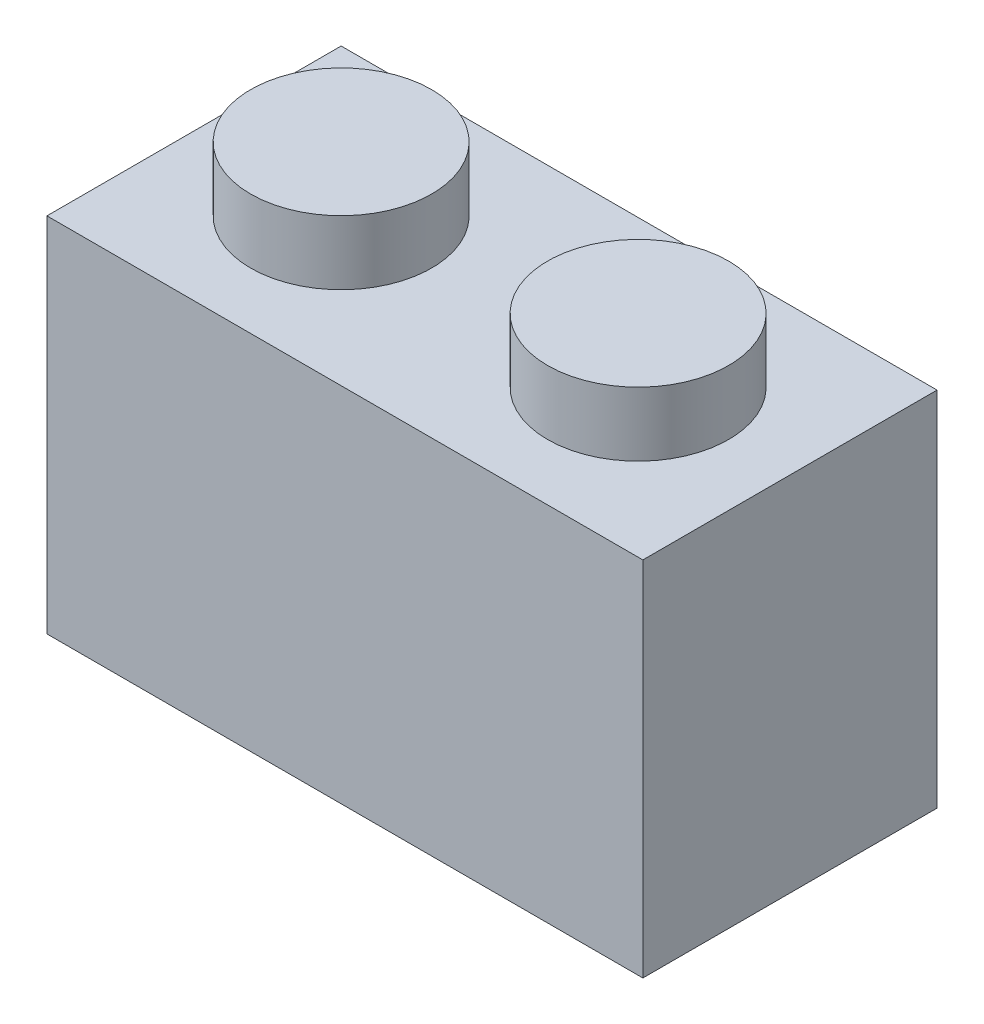
ISO-10303-21;
HEADER;
FILE_DESCRIPTION(('STEP AP214'),'2;1');
FILE_NAME('part.step','',(''),(''),'','','');
FILE_SCHEMA(('AUTOMOTIVE_DESIGN { 1 0 10303 214 1 1 1 1 }'));
ENDSEC;
DATA;
#1=APPLICATION_CONTEXT('core data for automotive mechanical design processes');
#2=APPLICATION_PROTOCOL_DEFINITION('international standard','automotive_design',2000,#1);
#3=PRODUCT_CONTEXT('',#1,'mechanical');
#4=PRODUCT('Part','Part','',(#3));
#5=PRODUCT_RELATED_PRODUCT_CATEGORY('part','',(#4));
#6=PRODUCT_DEFINITION_FORMATION('','',#4);
#7=PRODUCT_DEFINITION_CONTEXT('part definition',#1,'design');
#8=PRODUCT_DEFINITION('design','',#6,#7);
#9=PRODUCT_DEFINITION_SHAPE('','',#8);
#10=(LENGTH_UNIT() NAMED_UNIT(*) SI_UNIT(.MILLI.,.METRE.));
#11=(NAMED_UNIT(*) PLANE_ANGLE_UNIT() SI_UNIT($,.RADIAN.));
#12=(NAMED_UNIT(*) SI_UNIT($,.STERADIAN.) SOLID_ANGLE_UNIT());
#13=UNCERTAINTY_MEASURE_WITH_UNIT(LENGTH_MEASURE(1.E-05),#10,'distance_accuracy_value','');
#14=(GEOMETRIC_REPRESENTATION_CONTEXT(3) GLOBAL_UNCERTAINTY_ASSIGNED_CONTEXT((#13)) GLOBAL_UNIT_ASSIGNED_CONTEXT((#10,
#11,#12)) REPRESENTATION_CONTEXT('',''));
#15=CARTESIAN_POINT('',(0.,0.,0.));
#16=DIRECTION('',(0.,0.,1.));
#17=DIRECTION('',(1.,0.,0.));
#18=AXIS2_PLACEMENT_3D('',#15,#16,#17);
#19=CARTESIAN_POINT('',(-7.9,9.6,3.9));
#20=DIRECTION('',(1.,0.,0.));
#21=DIRECTION('',(0.,0.,-1.));
#22=AXIS2_PLACEMENT_3D('',#19,#20,#21);
#23=PLANE('',#22);
#24=DIRECTION('',(0.,0.,1.));
#25=VECTOR('',#24,1.);
#26=CARTESIAN_POINT('',(-7.9,0.,3.9));
#27=LINE('',#26,#25);
#28=CARTESIAN_POINT('',(-7.9,0.,-3.9));
#29=VERTEX_POINT('',#28);
#30=CARTESIAN_POINT('',(-7.9,0.,3.9));
#31=VERTEX_POINT('',#30);
#32=EDGE_CURVE('E96',#29,#31,#27,.T.);
#33=ORIENTED_EDGE('',*,*,#32,.T.);
#34=DIRECTION('',(0.,-1.,0.));
#35=VECTOR('',#34,1.);
#36=CARTESIAN_POINT('',(-7.9,9.6,3.9));
#37=LINE('',#36,#35);
#38=CARTESIAN_POINT('',(-7.9,9.6,3.9));
#39=VERTEX_POINT('',#38);
#40=EDGE_CURVE('E11',#39,#31,#37,.T.);
#41=ORIENTED_EDGE('',*,*,#40,.F.);
#42=DIRECTION('',(0.,0.,1.));
#43=VECTOR('',#42,1.);
#44=CARTESIAN_POINT('',(-7.9,9.6,3.9));
#45=LINE('',#44,#43);
#46=CARTESIAN_POINT('',(-7.9,9.6,-3.9));
#47=VERTEX_POINT('',#46);
#48=EDGE_CURVE('E84',#47,#39,#45,.T.);
#49=ORIENTED_EDGE('',*,*,#48,.F.);
#50=DIRECTION('',(0.,-1.,0.));
#51=VECTOR('',#50,1.);
#52=CARTESIAN_POINT('',(-7.9,9.6,-3.9));
#53=LINE('',#52,#51);
#54=EDGE_CURVE('E92',#47,#29,#53,.T.);
#55=ORIENTED_EDGE('',*,*,#54,.T.);
#56=EDGE_LOOP('',(#33,#41,#49,#55));
#57=FACE_BOUND('',#56,.T.);
#58=ADVANCED_FACE('F33',(#57),#23,.F.);
#59=CARTESIAN_POINT('',(7.9,9.6,3.9));
#60=DIRECTION('',(0.,0.,-1.));
#61=DIRECTION('',(-1.,0.,0.));
#62=AXIS2_PLACEMENT_3D('',#59,#60,#61);
#63=PLANE('',#62);
#64=DIRECTION('',(1.,0.,0.));
#65=VECTOR('',#64,1.);
#66=CARTESIAN_POINT('',(7.9,0.,3.9));
#67=LINE('',#66,#65);
#68=CARTESIAN_POINT('',(7.9,0.,3.9));
#69=VERTEX_POINT('',#68);
#70=EDGE_CURVE('E88',#31,#69,#67,.T.);
#71=ORIENTED_EDGE('',*,*,#70,.T.);
#72=DIRECTION('',(0.,-1.,0.));
#73=VECTOR('',#72,1.);
#74=CARTESIAN_POINT('',(7.9,9.6,3.9));
#75=LINE('',#74,#73);
#76=CARTESIAN_POINT('',(7.9,9.6,3.9));
#77=VERTEX_POINT('',#76);
#78=EDGE_CURVE('E41',#77,#69,#75,.T.);
#79=ORIENTED_EDGE('',*,*,#78,.F.);
#80=DIRECTION('',(1.,0.,0.));
#81=VECTOR('',#80,1.);
#82=CARTESIAN_POINT('',(7.9,9.6,3.9));
#83=LINE('',#82,#81);
#84=EDGE_CURVE('E79',#39,#77,#83,.T.);
#85=ORIENTED_EDGE('',*,*,#84,.F.);
#86=ORIENTED_EDGE('',*,*,#40,.T.);
#87=EDGE_LOOP('',(#71,#79,#85,#86));
#88=FACE_BOUND('',#87,.T.);
#89=ADVANCED_FACE('F87',(#88),#63,.F.);
#90=CARTESIAN_POINT('',(7.9,9.6,3.9));
#91=DIRECTION('',(-1.,0.,0.));
#92=DIRECTION('',(0.,0.,1.));
#93=AXIS2_PLACEMENT_3D('',#90,#91,#92);
#94=PLANE('',#93);
#95=DIRECTION('',(0.,0.,-1.));
#96=VECTOR('',#95,1.);
#97=CARTESIAN_POINT('',(7.9,0.,3.9));
#98=LINE('',#97,#96);
#99=CARTESIAN_POINT('',(7.9,0.,-3.9));
#100=VERTEX_POINT('',#99);
#101=EDGE_CURVE('E66',#69,#100,#98,.T.);
#102=ORIENTED_EDGE('',*,*,#101,.T.);
#103=DIRECTION('',(0.,-1.,0.));
#104=VECTOR('',#103,1.);
#105=CARTESIAN_POINT('',(7.9,9.6,-3.9));
#106=LINE('',#105,#104);
#107=CARTESIAN_POINT('',(7.9,9.6,-3.9));
#108=VERTEX_POINT('',#107);
#109=EDGE_CURVE('E89',#108,#100,#106,.T.);
#110=ORIENTED_EDGE('',*,*,#109,.F.);
#111=DIRECTION('',(0.,0.,-1.));
#112=VECTOR('',#111,1.);
#113=CARTESIAN_POINT('',(7.9,9.6,3.9));
#114=LINE('',#113,#112);
#115=EDGE_CURVE('E82',#77,#108,#114,.T.);
#116=ORIENTED_EDGE('',*,*,#115,.F.);
#117=ORIENTED_EDGE('',*,*,#78,.T.);
#118=EDGE_LOOP('',(#102,#110,#116,#117));
#119=FACE_BOUND('',#118,.T.);
#120=ADVANCED_FACE('F90',(#119),#94,.F.);
#121=CARTESIAN_POINT('',(7.9,9.6,-3.9));
#122=DIRECTION('',(0.,0.,1.));
#123=DIRECTION('',(1.,0.,0.));
#124=AXIS2_PLACEMENT_3D('',#121,#122,#123);
#125=PLANE('',#124);
#126=DIRECTION('',(-1.,0.,0.));
#127=VECTOR('',#126,1.);
#128=CARTESIAN_POINT('',(7.9,0.,-3.9));
#129=LINE('',#128,#127);
#130=EDGE_CURVE('E72',#100,#29,#129,.T.);
#131=ORIENTED_EDGE('',*,*,#130,.T.);
#132=ORIENTED_EDGE('',*,*,#54,.F.);
#133=DIRECTION('',(-1.,0.,0.));
#134=VECTOR('',#133,1.);
#135=CARTESIAN_POINT('',(7.9,9.6,-3.9));
#136=LINE('',#135,#134);
#137=EDGE_CURVE('E49',#108,#47,#136,.T.);
#138=ORIENTED_EDGE('',*,*,#137,.F.);
#139=ORIENTED_EDGE('',*,*,#109,.T.);
#140=EDGE_LOOP('',(#131,#132,#138,#139));
#141=FACE_BOUND('',#140,.T.);
#142=ADVANCED_FACE('F104',(#141),#125,.F.);
#143=CARTESIAN_POINT('',(0.,9.6,0.));
#144=DIRECTION('',(0.,1.,0.));
#145=DIRECTION('',(0.,0.,1.));
#146=AXIS2_PLACEMENT_3D('',#143,#144,#145);
#147=PLANE('',#146);
#148=CARTESIAN_POINT('',(3.874,9.6,0.));
#149=DIRECTION('',(0.,1.,0.));
#150=DIRECTION('',(0.,0.,1.));
#151=AXIS2_PLACEMENT_3D('',#148,#149,#150);
#152=CIRCLE('',#151,2.4);
#153=CARTESIAN_POINT('',(3.874,9.6,2.4));
#154=VERTEX_POINT('',#153);
#155=EDGE_CURVE('E116',#154,#154,#152,.T.);
#156=ORIENTED_EDGE('',*,*,#155,.F.);
#157=EDGE_LOOP('',(#156));
#158=FACE_BOUND('',#157,.T.);
#159=CARTESIAN_POINT('',(-4.,9.6,0.));
#160=DIRECTION('',(0.,1.,0.));
#161=DIRECTION('',(0.,0.,1.));
#162=AXIS2_PLACEMENT_3D('',#159,#160,#161);
#163=CIRCLE('',#162,2.4);
#164=CARTESIAN_POINT('',(-4.,9.6,2.4));
#165=VERTEX_POINT('',#164);
#166=EDGE_CURVE('E110',#165,#165,#163,.T.);
#167=ORIENTED_EDGE('',*,*,#166,.F.);
#168=EDGE_LOOP('',(#167));
#169=FACE_BOUND('',#168,.T.);
#170=ORIENTED_EDGE('',*,*,#48,.T.);
#171=ORIENTED_EDGE('',*,*,#84,.T.);
#172=ORIENTED_EDGE('',*,*,#115,.T.);
#173=ORIENTED_EDGE('',*,*,#137,.T.);
#174=EDGE_LOOP('',(#170,#171,#172,#173));
#175=FACE_BOUND('',#174,.T.);
#176=ADVANCED_FACE('F80',(#158,#169,#175),#147,.T.);
#177=CARTESIAN_POINT('',(0.,0.,0.));
#178=DIRECTION('',(0.,1.,0.));
#179=DIRECTION('',(0.,0.,1.));
#180=AXIS2_PLACEMENT_3D('',#177,#178,#179);
#181=PLANE('',#180);
#182=CARTESIAN_POINT('',(-4.,0.,0.));
#183=DIRECTION('',(0.,-1.,0.));
#184=DIRECTION('',(0.,0.,-1.));
#185=AXIS2_PLACEMENT_3D('',#182,#183,#184);
#186=CIRCLE('',#185,2.5);
#187=CARTESIAN_POINT('',(-4.,0.,-2.5));
#188=VERTEX_POINT('',#187);
#189=EDGE_CURVE('E128',#188,#188,#186,.T.);
#190=ORIENTED_EDGE('',*,*,#189,.F.);
#191=EDGE_LOOP('',(#190));
#192=FACE_BOUND('',#191,.T.);
#193=CARTESIAN_POINT('',(3.874,0.,0.));
#194=DIRECTION('',(0.,-1.,0.));
#195=DIRECTION('',(0.,0.,-1.));
#196=AXIS2_PLACEMENT_3D('',#193,#194,#195);
#197=CIRCLE('',#196,2.5);
#198=CARTESIAN_POINT('',(3.874,0.,-2.5));
#199=VERTEX_POINT('',#198);
#200=EDGE_CURVE('E122',#199,#199,#197,.T.);
#201=ORIENTED_EDGE('',*,*,#200,.F.);
#202=EDGE_LOOP('',(#201));
#203=FACE_BOUND('',#202,.T.);
#204=ORIENTED_EDGE('',*,*,#32,.F.);
#205=ORIENTED_EDGE('',*,*,#130,.F.);
#206=ORIENTED_EDGE('',*,*,#101,.F.);
#207=ORIENTED_EDGE('',*,*,#70,.F.);
#208=EDGE_LOOP('',(#204,#205,#206,#207));
#209=FACE_BOUND('',#208,.T.);
#210=ADVANCED_FACE('F107',(#192,#203,#209),#181,.F.);
#211=CARTESIAN_POINT('',(-4.,11.3,0.));
#212=DIRECTION('',(0.,-1.,0.));
#213=DIRECTION('',(0.,0.,-1.));
#214=AXIS2_PLACEMENT_3D('',#211,#212,#213);
#215=CYLINDRICAL_SURFACE('',#214,2.4);
#216=CARTESIAN_POINT('',(-4.,11.3,0.));
#217=DIRECTION('',(0.,1.,0.));
#218=DIRECTION('',(0.,0.,1.));
#219=AXIS2_PLACEMENT_3D('',#216,#217,#218);
#220=CIRCLE('',#219,2.4);
#221=CARTESIAN_POINT('',(-4.,11.3,2.4));
#222=VERTEX_POINT('',#221);
#223=EDGE_CURVE('E99',#222,#222,#220,.T.);
#224=ORIENTED_EDGE('',*,*,#223,.F.);
#225=EDGE_LOOP('',(#224));
#226=FACE_BOUND('',#225,.T.);
#227=ORIENTED_EDGE('',*,*,#166,.T.);
#228=EDGE_LOOP('',(#227));
#229=FACE_BOUND('',#228,.T.);
#230=ADVANCED_FACE('F145',(#226,#229),#215,.T.);
#231=CARTESIAN_POINT('',(-4.,11.3,0.));
#232=DIRECTION('',(0.,1.,0.));
#233=DIRECTION('',(0.,0.,1.));
#234=AXIS2_PLACEMENT_3D('',#231,#232,#233);
#235=PLANE('',#234);
#236=ORIENTED_EDGE('',*,*,#223,.T.);
#237=EDGE_LOOP('',(#236));
#238=FACE_BOUND('',#237,.T.);
#239=ADVANCED_FACE('F180',(#238),#235,.T.);
#240=CARTESIAN_POINT('',(3.874,11.3,0.));
#241=DIRECTION('',(0.,-1.,0.));
#242=DIRECTION('',(0.,0.,-1.));
#243=AXIS2_PLACEMENT_3D('',#240,#241,#242);
#244=CYLINDRICAL_SURFACE('',#243,2.4);
#245=CARTESIAN_POINT('',(3.874,11.3,0.));
#246=DIRECTION('',(0.,1.,0.));
#247=DIRECTION('',(0.,0.,1.));
#248=AXIS2_PLACEMENT_3D('',#245,#246,#247);
#249=CIRCLE('',#248,2.4);
#250=CARTESIAN_POINT('',(3.874,11.3,2.4));
#251=VERTEX_POINT('',#250);
#252=EDGE_CURVE('E113',#251,#251,#249,.T.);
#253=ORIENTED_EDGE('',*,*,#252,.F.);
#254=EDGE_LOOP('',(#253));
#255=FACE_BOUND('',#254,.T.);
#256=ORIENTED_EDGE('',*,*,#155,.T.);
#257=EDGE_LOOP('',(#256));
#258=FACE_BOUND('',#257,.T.);
#259=ADVANCED_FACE('F160',(#255,#258),#244,.T.);
#260=CARTESIAN_POINT('',(3.874,11.3,0.));
#261=DIRECTION('',(0.,1.,0.));
#262=DIRECTION('',(0.,0.,1.));
#263=AXIS2_PLACEMENT_3D('',#260,#261,#262);
#264=PLANE('',#263);
#265=ORIENTED_EDGE('',*,*,#252,.T.);
#266=EDGE_LOOP('',(#265));
#267=FACE_BOUND('',#266,.T.);
#268=ADVANCED_FACE('F151',(#267),#264,.T.);
#269=CARTESIAN_POINT('',(3.874,1.8,0.));
#270=DIRECTION('',(0.,-1.,0.));
#271=DIRECTION('',(0.,0.,-1.));
#272=AXIS2_PLACEMENT_3D('',#269,#270,#271);
#273=CYLINDRICAL_SURFACE('',#272,2.5);
#274=CARTESIAN_POINT('',(3.874,1.8,0.));
#275=DIRECTION('',(0.,-1.,0.));
#276=DIRECTION('',(0.,0.,-1.));
#277=AXIS2_PLACEMENT_3D('',#274,#275,#276);
#278=CIRCLE('',#277,2.5);
#279=CARTESIAN_POINT('',(3.874,1.8,-2.5));
#280=VERTEX_POINT('',#279);
#281=EDGE_CURVE('E125',#280,#280,#278,.T.);
#282=ORIENTED_EDGE('',*,*,#281,.F.);
#283=EDGE_LOOP('',(#282));
#284=FACE_BOUND('',#283,.T.);
#285=ORIENTED_EDGE('',*,*,#200,.T.);
#286=EDGE_LOOP('',(#285));
#287=FACE_BOUND('',#286,.T.);
#288=ADVANCED_FACE('F149',(#284,#287),#273,.F.);
#289=CARTESIAN_POINT('',(3.874,1.8,0.));
#290=DIRECTION('',(0.,-1.,0.));
#291=DIRECTION('',(0.,0.,-1.));
#292=AXIS2_PLACEMENT_3D('',#289,#290,#291);
#293=PLANE('',#292);
#294=ORIENTED_EDGE('',*,*,#281,.T.);
#295=EDGE_LOOP('',(#294));
#296=FACE_BOUND('',#295,.T.);
#297=ADVANCED_FACE('F139',(#296),#293,.T.);
#298=CARTESIAN_POINT('',(-4.,1.8,0.));
#299=DIRECTION('',(0.,-1.,0.));
#300=DIRECTION('',(0.,0.,-1.));
#301=AXIS2_PLACEMENT_3D('',#298,#299,#300);
#302=CYLINDRICAL_SURFACE('',#301,2.5);
#303=CARTESIAN_POINT('',(-4.,1.8,0.));
#304=DIRECTION('',(0.,-1.,0.));
#305=DIRECTION('',(0.,0.,-1.));
#306=AXIS2_PLACEMENT_3D('',#303,#304,#305);
#307=CIRCLE('',#306,2.5);
#308=CARTESIAN_POINT('',(-4.,1.8,-2.5));
#309=VERTEX_POINT('',#308);
#310=EDGE_CURVE('E119',#309,#309,#307,.T.);
#311=ORIENTED_EDGE('',*,*,#310,.F.);
#312=EDGE_LOOP('',(#311));
#313=FACE_BOUND('',#312,.T.);
#314=ORIENTED_EDGE('',*,*,#189,.T.);
#315=EDGE_LOOP('',(#314));
#316=FACE_BOUND('',#315,.T.);
#317=ADVANCED_FACE('F136',(#313,#316),#302,.F.);
#318=CARTESIAN_POINT('',(-4.,1.8,0.));
#319=DIRECTION('',(0.,-1.,0.));
#320=DIRECTION('',(0.,0.,-1.));
#321=AXIS2_PLACEMENT_3D('',#318,#319,#320);
#322=PLANE('',#321);
#323=ORIENTED_EDGE('',*,*,#310,.T.);
#324=EDGE_LOOP('',(#323));
#325=FACE_BOUND('',#324,.T.);
#326=ADVANCED_FACE('F134',(#325),#322,.T.);
#327=CLOSED_SHELL('',(#58,#89,#120,#142,#176,#210,#230,#239,#259,#268,#288,#297,#317,#326));
#328=MANIFOLD_SOLID_BREP('B2',#327);
#329=ADVANCED_BREP_SHAPE_REPRESENTATION('',(#18,#328),#14);
#330=SHAPE_DEFINITION_REPRESENTATION(#9,#329);
ENDSEC;
END-ISO-10303-21;
